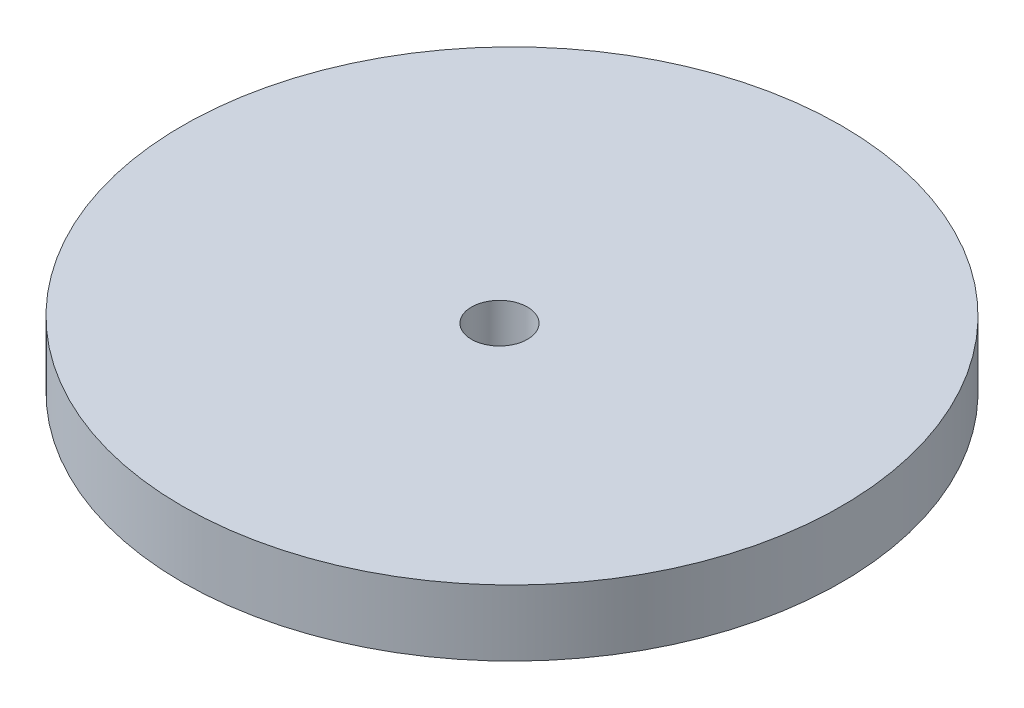
ISO-10303-21;
HEADER;
FILE_DESCRIPTION(('STEP AP214'),'2;1');
FILE_NAME('part.step','',(''),(''),'','','');
FILE_SCHEMA(('AUTOMOTIVE_DESIGN { 1 0 10303 214 1 1 1 1 }'));
ENDSEC;
DATA;
#1=APPLICATION_CONTEXT('core data for automotive mechanical design processes');
#2=APPLICATION_PROTOCOL_DEFINITION('international standard','automotive_design',2000,#1);
#3=PRODUCT_CONTEXT('',#1,'mechanical');
#4=PRODUCT('Part','Part','',(#3));
#5=PRODUCT_RELATED_PRODUCT_CATEGORY('part','',(#4));
#6=PRODUCT_DEFINITION_FORMATION('','',#4);
#7=PRODUCT_DEFINITION_CONTEXT('part definition',#1,'design');
#8=PRODUCT_DEFINITION('design','',#6,#7);
#9=PRODUCT_DEFINITION_SHAPE('','',#8);
#10=(LENGTH_UNIT() NAMED_UNIT(*) SI_UNIT(.MILLI.,.METRE.));
#11=(NAMED_UNIT(*) PLANE_ANGLE_UNIT() SI_UNIT($,.RADIAN.));
#12=(NAMED_UNIT(*) SI_UNIT($,.STERADIAN.) SOLID_ANGLE_UNIT());
#13=UNCERTAINTY_MEASURE_WITH_UNIT(LENGTH_MEASURE(1.E-05),#10,'distance_accuracy_value','');
#14=(GEOMETRIC_REPRESENTATION_CONTEXT(3) GLOBAL_UNCERTAINTY_ASSIGNED_CONTEXT((#13)) GLOBAL_UNIT_ASSIGNED_CONTEXT((#10,
#11,#12)) REPRESENTATION_CONTEXT('',''));
#15=CARTESIAN_POINT('',(0.,0.,0.));
#16=DIRECTION('',(0.,0.,1.));
#17=DIRECTION('',(1.,0.,0.));
#18=AXIS2_PLACEMENT_3D('',#15,#16,#17);
#19=CARTESIAN_POINT('',(0.,20.,0.));
#20=DIRECTION('',(0.,1.,0.));
#21=DIRECTION('',(0.,0.,1.));
#22=AXIS2_PLACEMENT_3D('',#19,#20,#21);
#23=PLANE('',#22);
#24=CARTESIAN_POINT('',(0.,20.,0.));
#25=DIRECTION('',(0.,1.,0.));
#26=DIRECTION('',(0.,0.,1.));
#27=AXIS2_PLACEMENT_3D('',#24,#25,#26);
#28=CIRCLE('',#27,100.);
#29=CARTESIAN_POINT('',(0.,20.,100.));
#30=VERTEX_POINT('',#29);
#31=EDGE_CURVE('E10',#30,#30,#28,.T.);
#32=ORIENTED_EDGE('',*,*,#31,.T.);
#33=EDGE_LOOP('',(#32));
#34=FACE_BOUND('',#33,.T.);
#35=CARTESIAN_POINT('',(0.,20.,3.80217558429466));
#36=DIRECTION('',(0.,1.,0.));
#37=DIRECTION('',(0.,0.,1.));
#38=AXIS2_PLACEMENT_3D('',#35,#36,#37);
#39=CIRCLE('',#38,8.5);
#40=CARTESIAN_POINT('',(0.,20.,12.3021755842947));
#41=VERTEX_POINT('',#40);
#42=EDGE_CURVE('E56',#41,#41,#39,.T.);
#43=ORIENTED_EDGE('',*,*,#42,.F.);
#44=EDGE_LOOP('',(#43));
#45=FACE_BOUND('',#44,.T.);
#46=ADVANCED_FACE('F43',(#34,#45),#23,.T.);
#47=CARTESIAN_POINT('',(0.,0.,0.));
#48=DIRECTION('',(0.,1.,0.));
#49=DIRECTION('',(0.,0.,1.));
#50=AXIS2_PLACEMENT_3D('',#47,#48,#49);
#51=PLANE('',#50);
#52=CARTESIAN_POINT('',(0.,0.,0.));
#53=DIRECTION('',(0.,1.,0.));
#54=DIRECTION('',(0.,0.,1.));
#55=AXIS2_PLACEMENT_3D('',#52,#53,#54);
#56=CIRCLE('',#55,100.);
#57=CARTESIAN_POINT('',(0.,0.,100.));
#58=VERTEX_POINT('',#57);
#59=EDGE_CURVE('E47',#58,#58,#56,.T.);
#60=ORIENTED_EDGE('',*,*,#59,.F.);
#61=EDGE_LOOP('',(#60));
#62=FACE_BOUND('',#61,.T.);
#63=CARTESIAN_POINT('',(0.,0.,3.80217558429466));
#64=DIRECTION('',(0.,1.,0.));
#65=DIRECTION('',(0.,0.,1.));
#66=AXIS2_PLACEMENT_3D('',#63,#64,#65);
#67=CIRCLE('',#66,8.5);
#68=CARTESIAN_POINT('',(0.,0.,12.3021755842947));
#69=VERTEX_POINT('',#68);
#70=EDGE_CURVE('E58',#69,#69,#67,.T.);
#71=ORIENTED_EDGE('',*,*,#70,.T.);
#72=EDGE_LOOP('',(#71));
#73=FACE_BOUND('',#72,.T.);
#74=ADVANCED_FACE('F70',(#62,#73),#51,.F.);
#75=CARTESIAN_POINT('',(0.,20.,0.));
#76=DIRECTION('',(0.,-1.,0.));
#77=DIRECTION('',(0.,0.,-1.));
#78=AXIS2_PLACEMENT_3D('',#75,#76,#77);
#79=CYLINDRICAL_SURFACE('',#78,100.);
#80=ORIENTED_EDGE('',*,*,#31,.F.);
#81=EDGE_LOOP('',(#80));
#82=FACE_BOUND('',#81,.T.);
#83=ORIENTED_EDGE('',*,*,#59,.T.);
#84=EDGE_LOOP('',(#83));
#85=FACE_BOUND('',#84,.T.);
#86=ADVANCED_FACE('F45',(#82,#85),#79,.T.);
#87=CARTESIAN_POINT('',(0.,20.,3.80217558429466));
#88=DIRECTION('',(0.,-1.,0.));
#89=DIRECTION('',(0.,0.,-1.));
#90=AXIS2_PLACEMENT_3D('',#87,#88,#89);
#91=CYLINDRICAL_SURFACE('',#90,8.5);
#92=ORIENTED_EDGE('',*,*,#42,.T.);
#93=EDGE_LOOP('',(#92));
#94=FACE_BOUND('',#93,.T.);
#95=ORIENTED_EDGE('',*,*,#70,.F.);
#96=EDGE_LOOP('',(#95));
#97=FACE_BOUND('',#96,.T.);
#98=ADVANCED_FACE('F66',(#94,#97),#91,.F.);
#99=CLOSED_SHELL('',(#46,#74,#86,#98));
#100=MANIFOLD_SOLID_BREP('B2',#99);
#101=ADVANCED_BREP_SHAPE_REPRESENTATION('',(#18,#100),#14);
#102=SHAPE_DEFINITION_REPRESENTATION(#9,#101);
ENDSEC;
END-ISO-10303-21;
